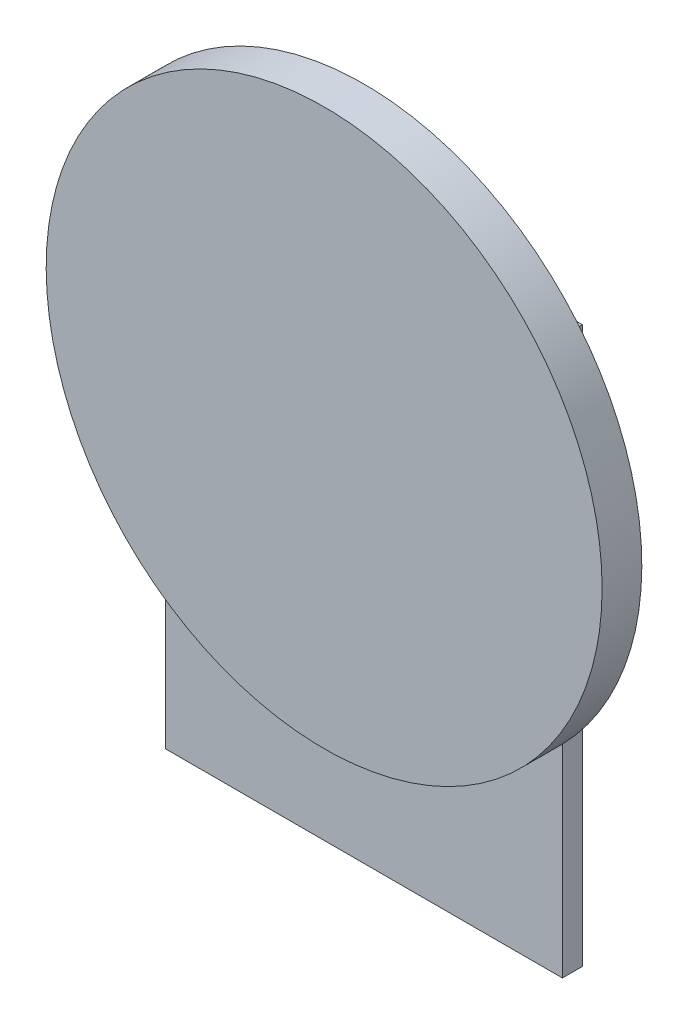
ISO-10303-21;
HEADER;
FILE_DESCRIPTION(('STEP AP214'),'2;1');
FILE_NAME('part.step','',(''),(''),'','','');
FILE_SCHEMA(('AUTOMOTIVE_DESIGN { 1 0 10303 214 1 1 1 1 }'));
ENDSEC;
DATA;
#1=APPLICATION_CONTEXT('core data for automotive mechanical design processes');
#2=APPLICATION_PROTOCOL_DEFINITION('international standard','automotive_design',2000,#1);
#3=PRODUCT_CONTEXT('',#1,'mechanical');
#4=PRODUCT('Part','Part','',(#3));
#5=PRODUCT_RELATED_PRODUCT_CATEGORY('part','',(#4));
#6=PRODUCT_DEFINITION_FORMATION('','',#4);
#7=PRODUCT_DEFINITION_CONTEXT('part definition',#1,'design');
#8=PRODUCT_DEFINITION('design','',#6,#7);
#9=PRODUCT_DEFINITION_SHAPE('','',#8);
#10=(LENGTH_UNIT() NAMED_UNIT(*) SI_UNIT(.MILLI.,.METRE.));
#11=(NAMED_UNIT(*) PLANE_ANGLE_UNIT() SI_UNIT($,.RADIAN.));
#12=(NAMED_UNIT(*) SI_UNIT($,.STERADIAN.) SOLID_ANGLE_UNIT());
#13=UNCERTAINTY_MEASURE_WITH_UNIT(LENGTH_MEASURE(1.E-05),#10,'distance_accuracy_value','');
#14=(GEOMETRIC_REPRESENTATION_CONTEXT(3) GLOBAL_UNCERTAINTY_ASSIGNED_CONTEXT((#13)) GLOBAL_UNIT_ASSIGNED_CONTEXT((#10,
#11,#12)) REPRESENTATION_CONTEXT('',''));
#15=CARTESIAN_POINT('',(0.,0.,0.));
#16=DIRECTION('',(0.,0.,1.));
#17=DIRECTION('',(1.,0.,0.));
#18=AXIS2_PLACEMENT_3D('',#15,#16,#17);
#19=CARTESIAN_POINT('',(0.,0.,0.));
#20=DIRECTION('',(0.,0.,1.));
#21=DIRECTION('',(1.,0.,0.));
#22=AXIS2_PLACEMENT_3D('',#19,#20,#21);
#23=PLANE('',#22);
#24=DIRECTION('',(0.,-1.,0.));
#25=VECTOR('',#24,1.);
#26=CARTESIAN_POINT('',(5.,4.,0.));
#27=LINE('',#26,#25);
#28=CARTESIAN_POINT('',(5.,4.,0.));
#29=VERTEX_POINT('',#28);
#30=CARTESIAN_POINT('',(5.,-4.89897948556636,0.));
#31=VERTEX_POINT('',#30);
#32=EDGE_CURVE('E51',#29,#31,#27,.T.);
#33=ORIENTED_EDGE('',*,*,#32,.F.);
#34=DIRECTION('',(1.,0.,0.));
#35=VECTOR('',#34,1.);
#36=CARTESIAN_POINT('',(5.,4.,0.));
#37=LINE('',#36,#35);
#38=CARTESIAN_POINT('',(-5.,4.,0.));
#39=VERTEX_POINT('',#38);
#40=EDGE_CURVE('E101',#39,#29,#37,.T.);
#41=ORIENTED_EDGE('',*,*,#40,.F.);
#42=DIRECTION('',(0.,1.,0.));
#43=VECTOR('',#42,1.);
#44=CARTESIAN_POINT('',(-5.,4.,0.));
#45=LINE('',#44,#43);
#46=CARTESIAN_POINT('',(-5.,-4.89897948556636,0.));
#47=VERTEX_POINT('',#46);
#48=EDGE_CURVE('E11',#47,#39,#45,.T.);
#49=ORIENTED_EDGE('',*,*,#48,.F.);
#50=CARTESIAN_POINT('',(0.,0.,0.));
#51=DIRECTION('',(0.,0.,1.));
#52=DIRECTION('',(1.,0.,0.));
#53=AXIS2_PLACEMENT_3D('',#50,#51,#52);
#54=CIRCLE('',#53,7.);
#55=EDGE_CURVE('E56',#31,#47,#54,.T.);
#56=ORIENTED_EDGE('',*,*,#55,.F.);
#57=EDGE_LOOP('',(#33,#41,#49,#56));
#58=FACE_BOUND('',#57,.T.);
#59=ADVANCED_FACE('F33',(#58),#23,.F.);
#60=CARTESIAN_POINT('',(0.,0.,1.));
#61=DIRECTION('',(0.,0.,-1.));
#62=DIRECTION('',(-1.,0.,0.));
#63=AXIS2_PLACEMENT_3D('',#60,#61,#62);
#64=CYLINDRICAL_SURFACE('',#63,7.);
#65=CARTESIAN_POINT('',(0.,0.,1.));
#66=DIRECTION('',(0.,0.,1.));
#67=DIRECTION('',(1.,0.,0.));
#68=AXIS2_PLACEMENT_3D('',#65,#66,#67);
#69=CIRCLE('',#68,7.);
#70=CARTESIAN_POINT('',(7.,0.,1.));
#71=VERTEX_POINT('',#70);
#72=EDGE_CURVE('E42',#71,#71,#69,.T.);
#73=ORIENTED_EDGE('',*,*,#72,.F.);
#74=EDGE_LOOP('',(#73));
#75=FACE_BOUND('',#74,.T.);
#76=EDGE_CURVE('E37',#47,#31,#54,.T.);
#77=ORIENTED_EDGE('',*,*,#76,.T.);
#78=ORIENTED_EDGE('',*,*,#55,.T.);
#79=EDGE_LOOP('',(#77,#78));
#80=FACE_BOUND('',#79,.T.);
#81=ADVANCED_FACE('F35',(#75,#80),#64,.T.);
#82=CARTESIAN_POINT('',(0.,0.,1.));
#83=DIRECTION('',(0.,0.,1.));
#84=DIRECTION('',(1.,0.,0.));
#85=AXIS2_PLACEMENT_3D('',#82,#83,#84);
#86=PLANE('',#85);
#87=ORIENTED_EDGE('',*,*,#72,.T.);
#88=EDGE_LOOP('',(#87));
#89=FACE_BOUND('',#88,.T.);
#90=ADVANCED_FACE('F138',(#89),#86,.T.);
#91=CARTESIAN_POINT('',(5.,4.,-0.5));
#92=DIRECTION('',(-1.,0.,0.));
#93=DIRECTION('',(0.,0.,1.));
#94=AXIS2_PLACEMENT_3D('',#91,#92,#93);
#95=PLANE('',#94);
#96=ORIENTED_EDGE('',*,*,#32,.T.);
#97=CARTESIAN_POINT('',(5.,-10.,0.));
#98=VERTEX_POINT('',#97);
#99=EDGE_CURVE('E105',#31,#98,#27,.T.);
#100=ORIENTED_EDGE('',*,*,#99,.T.);
#101=DIRECTION('',(0.,0.,1.));
#102=VECTOR('',#101,1.);
#103=CARTESIAN_POINT('',(5.,-10.,-0.5));
#104=LINE('',#103,#102);
#105=CARTESIAN_POINT('',(5.,-10.,-0.5));
#106=VERTEX_POINT('',#105);
#107=EDGE_CURVE('E86',#106,#98,#104,.T.);
#108=ORIENTED_EDGE('',*,*,#107,.F.);
#109=DIRECTION('',(0.,-1.,0.));
#110=VECTOR('',#109,1.);
#111=CARTESIAN_POINT('',(5.,4.,-0.5));
#112=LINE('',#111,#110);
#113=CARTESIAN_POINT('',(5.,4.,-0.5));
#114=VERTEX_POINT('',#113);
#115=EDGE_CURVE('E92',#114,#106,#112,.T.);
#116=ORIENTED_EDGE('',*,*,#115,.F.);
#117=DIRECTION('',(0.,0.,1.));
#118=VECTOR('',#117,1.);
#119=CARTESIAN_POINT('',(5.,4.,-0.5));
#120=LINE('',#119,#118);
#121=EDGE_CURVE('E122',#114,#29,#120,.T.);
#122=ORIENTED_EDGE('',*,*,#121,.T.);
#123=EDGE_LOOP('',(#96,#100,#108,#116,#122));
#124=FACE_BOUND('',#123,.T.);
#125=ADVANCED_FACE('F103',(#124),#95,.F.);
#126=CARTESIAN_POINT('',(5.,-10.,-0.5));
#127=DIRECTION('',(0.,1.,0.));
#128=DIRECTION('',(0.,0.,1.));
#129=AXIS2_PLACEMENT_3D('',#126,#127,#128);
#130=PLANE('',#129);
#131=DIRECTION('',(-1.,0.,0.));
#132=VECTOR('',#131,1.);
#133=CARTESIAN_POINT('',(5.,-10.,0.));
#134=LINE('',#133,#132);
#135=CARTESIAN_POINT('',(-5.,-10.,0.));
#136=VERTEX_POINT('',#135);
#137=EDGE_CURVE('E120',#98,#136,#134,.T.);
#138=ORIENTED_EDGE('',*,*,#137,.T.);
#139=DIRECTION('',(0.,0.,1.));
#140=VECTOR('',#139,1.);
#141=CARTESIAN_POINT('',(-5.,-10.,-0.5));
#142=LINE('',#141,#140);
#143=CARTESIAN_POINT('',(-5.,-10.,-0.5));
#144=VERTEX_POINT('',#143);
#145=EDGE_CURVE('E88',#144,#136,#142,.T.);
#146=ORIENTED_EDGE('',*,*,#145,.F.);
#147=DIRECTION('',(-1.,0.,0.));
#148=VECTOR('',#147,1.);
#149=CARTESIAN_POINT('',(5.,-10.,-0.5));
#150=LINE('',#149,#148);
#151=EDGE_CURVE('E82',#106,#144,#150,.T.);
#152=ORIENTED_EDGE('',*,*,#151,.F.);
#153=ORIENTED_EDGE('',*,*,#107,.T.);
#154=EDGE_LOOP('',(#138,#146,#152,#153));
#155=FACE_BOUND('',#154,.T.);
#156=ADVANCED_FACE('F84',(#155),#130,.F.);
#157=CARTESIAN_POINT('',(-5.,4.,-0.5));
#158=DIRECTION('',(1.,0.,0.));
#159=DIRECTION('',(0.,0.,-1.));
#160=AXIS2_PLACEMENT_3D('',#157,#158,#159);
#161=PLANE('',#160);
#162=EDGE_CURVE('E44',#136,#47,#45,.T.);
#163=ORIENTED_EDGE('',*,*,#162,.T.);
#164=ORIENTED_EDGE('',*,*,#48,.T.);
#165=DIRECTION('',(0.,0.,1.));
#166=VECTOR('',#165,1.);
#167=CARTESIAN_POINT('',(-5.,4.,-0.5));
#168=LINE('',#167,#166);
#169=CARTESIAN_POINT('',(-5.,4.,-0.5));
#170=VERTEX_POINT('',#169);
#171=EDGE_CURVE('E108',#170,#39,#168,.T.);
#172=ORIENTED_EDGE('',*,*,#171,.F.);
#173=DIRECTION('',(0.,1.,0.));
#174=VECTOR('',#173,1.);
#175=CARTESIAN_POINT('',(-5.,4.,-0.5));
#176=LINE('',#175,#174);
#177=EDGE_CURVE('E91',#144,#170,#176,.T.);
#178=ORIENTED_EDGE('',*,*,#177,.F.);
#179=ORIENTED_EDGE('',*,*,#145,.T.);
#180=EDGE_LOOP('',(#163,#164,#172,#178,#179));
#181=FACE_BOUND('',#180,.T.);
#182=ADVANCED_FACE('F133',(#181),#161,.F.);
#183=CARTESIAN_POINT('',(5.,4.,-0.5));
#184=DIRECTION('',(0.,-1.,0.));
#185=DIRECTION('',(0.,0.,-1.));
#186=AXIS2_PLACEMENT_3D('',#183,#184,#185);
#187=PLANE('',#186);
#188=ORIENTED_EDGE('',*,*,#40,.T.);
#189=ORIENTED_EDGE('',*,*,#121,.F.);
#190=DIRECTION('',(1.,0.,0.));
#191=VECTOR('',#190,1.);
#192=CARTESIAN_POINT('',(5.,4.,-0.5));
#193=LINE('',#192,#191);
#194=EDGE_CURVE('E97',#170,#114,#193,.T.);
#195=ORIENTED_EDGE('',*,*,#194,.F.);
#196=ORIENTED_EDGE('',*,*,#171,.T.);
#197=EDGE_LOOP('',(#188,#189,#195,#196));
#198=FACE_BOUND('',#197,.T.);
#199=ADVANCED_FACE('F131',(#198),#187,.F.);
#200=CARTESIAN_POINT('',(0.,0.,-0.5));
#201=DIRECTION('',(0.,0.,-1.));
#202=DIRECTION('',(-1.,0.,0.));
#203=AXIS2_PLACEMENT_3D('',#200,#201,#202);
#204=PLANE('',#203);
#205=ORIENTED_EDGE('',*,*,#115,.T.);
#206=ORIENTED_EDGE('',*,*,#151,.T.);
#207=ORIENTED_EDGE('',*,*,#177,.T.);
#208=ORIENTED_EDGE('',*,*,#194,.T.);
#209=EDGE_LOOP('',(#205,#206,#207,#208));
#210=FACE_BOUND('',#209,.T.);
#211=ADVANCED_FACE('F95',(#210),#204,.T.);
#212=CARTESIAN_POINT('',(0.,0.,0.));
#213=DIRECTION('',(0.,0.,-1.));
#214=DIRECTION('',(-1.,0.,0.));
#215=AXIS2_PLACEMENT_3D('',#212,#213,#214);
#216=PLANE('',#215);
#217=ORIENTED_EDGE('',*,*,#76,.F.);
#218=ORIENTED_EDGE('',*,*,#162,.F.);
#219=ORIENTED_EDGE('',*,*,#137,.F.);
#220=ORIENTED_EDGE('',*,*,#99,.F.);
#221=EDGE_LOOP('',(#217,#218,#219,#220));
#222=FACE_BOUND('',#221,.T.);
#223=ADVANCED_FACE('F119',(#222),#216,.F.);
#224=CLOSED_SHELL('',(#59,#81,#90,#125,#156,#182,#199,#211,#223));
#225=MANIFOLD_SOLID_BREP('B2',#224);
#226=ADVANCED_BREP_SHAPE_REPRESENTATION('',(#18,#225),#14);
#227=SHAPE_DEFINITION_REPRESENTATION(#9,#226);
ENDSEC;
END-ISO-10303-21;
